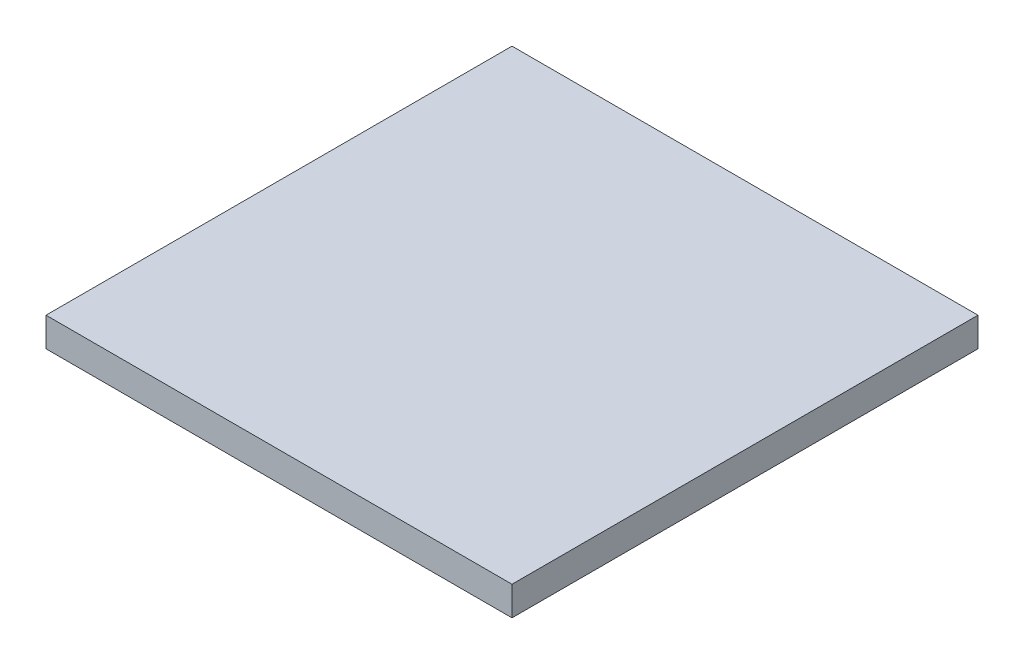
ISO-10303-21;
HEADER;
FILE_DESCRIPTION(('STEP AP214'),'2;1');
FILE_NAME('part.step','',(''),(''),'','','');
FILE_SCHEMA(('AUTOMOTIVE_DESIGN { 1 0 10303 214 1 1 1 1 }'));
ENDSEC;
DATA;
#1=APPLICATION_CONTEXT('core data for automotive mechanical design processes');
#2=APPLICATION_PROTOCOL_DEFINITION('international standard','automotive_design',2000,#1);
#3=PRODUCT_CONTEXT('',#1,'mechanical');
#4=PRODUCT('Part','Part','',(#3));
#5=PRODUCT_RELATED_PRODUCT_CATEGORY('part','',(#4));
#6=PRODUCT_DEFINITION_FORMATION('','',#4);
#7=PRODUCT_DEFINITION_CONTEXT('part definition',#1,'design');
#8=PRODUCT_DEFINITION('design','',#6,#7);
#9=PRODUCT_DEFINITION_SHAPE('','',#8);
#10=(LENGTH_UNIT() NAMED_UNIT(*) SI_UNIT(.MILLI.,.METRE.));
#11=(NAMED_UNIT(*) PLANE_ANGLE_UNIT() SI_UNIT($,.RADIAN.));
#12=(NAMED_UNIT(*) SI_UNIT($,.STERADIAN.) SOLID_ANGLE_UNIT());
#13=UNCERTAINTY_MEASURE_WITH_UNIT(LENGTH_MEASURE(1.E-05),#10,'distance_accuracy_value','');
#14=(GEOMETRIC_REPRESENTATION_CONTEXT(3) GLOBAL_UNCERTAINTY_ASSIGNED_CONTEXT((#13)) GLOBAL_UNIT_ASSIGNED_CONTEXT((#10,
#11,#12)) REPRESENTATION_CONTEXT('',''));
#15=CARTESIAN_POINT('',(0.,0.,0.));
#16=DIRECTION('',(0.,0.,1.));
#17=DIRECTION('',(1.,0.,0.));
#18=AXIS2_PLACEMENT_3D('',#15,#16,#17);
#19=CARTESIAN_POINT('',(304.8,38.1,-304.8));
#20=DIRECTION('',(-1.,0.,0.));
#21=DIRECTION('',(0.,0.,1.));
#22=AXIS2_PLACEMENT_3D('',#19,#20,#21);
#23=PLANE('',#22);
#24=DIRECTION('',(0.,0.,-1.));
#25=VECTOR('',#24,1.);
#26=CARTESIAN_POINT('',(304.8,0.,-304.8));
#27=LINE('',#26,#25);
#28=CARTESIAN_POINT('',(304.8,0.,304.8));
#29=VERTEX_POINT('',#28);
#30=CARTESIAN_POINT('',(304.8,0.,-304.8));
#31=VERTEX_POINT('',#30);
#32=EDGE_CURVE('E95',#29,#31,#27,.T.);
#33=ORIENTED_EDGE('',*,*,#32,.T.);
#34=DIRECTION('',(0.,-1.,0.));
#35=VECTOR('',#34,1.);
#36=CARTESIAN_POINT('',(304.8,38.1,-304.8));
#37=LINE('',#36,#35);
#38=CARTESIAN_POINT('',(304.8,38.1,-304.8));
#39=VERTEX_POINT('',#38);
#40=EDGE_CURVE('E11',#39,#31,#37,.T.);
#41=ORIENTED_EDGE('',*,*,#40,.F.);
#42=DIRECTION('',(0.,0.,-1.));
#43=VECTOR('',#42,1.);
#44=CARTESIAN_POINT('',(304.8,38.1,-304.8));
#45=LINE('',#44,#43);
#46=CARTESIAN_POINT('',(304.8,38.1,304.8));
#47=VERTEX_POINT('',#46);
#48=EDGE_CURVE('E83',#47,#39,#45,.T.);
#49=ORIENTED_EDGE('',*,*,#48,.F.);
#50=DIRECTION('',(0.,-1.,0.));
#51=VECTOR('',#50,1.);
#52=CARTESIAN_POINT('',(304.8,38.1,304.8));
#53=LINE('',#52,#51);
#54=EDGE_CURVE('E91',#47,#29,#53,.T.);
#55=ORIENTED_EDGE('',*,*,#54,.T.);
#56=EDGE_LOOP('',(#33,#41,#49,#55));
#57=FACE_BOUND('',#56,.T.);
#58=ADVANCED_FACE('F32',(#57),#23,.F.);
#59=CARTESIAN_POINT('',(-304.8,38.1,-304.8));
#60=DIRECTION('',(0.,0.,1.));
#61=DIRECTION('',(1.,0.,0.));
#62=AXIS2_PLACEMENT_3D('',#59,#60,#61);
#63=PLANE('',#62);
#64=DIRECTION('',(-1.,0.,0.));
#65=VECTOR('',#64,1.);
#66=CARTESIAN_POINT('',(-304.8,0.,-304.8));
#67=LINE('',#66,#65);
#68=CARTESIAN_POINT('',(-304.8,0.,-304.8));
#69=VERTEX_POINT('',#68);
#70=EDGE_CURVE('E87',#31,#69,#67,.T.);
#71=ORIENTED_EDGE('',*,*,#70,.T.);
#72=DIRECTION('',(0.,-1.,0.));
#73=VECTOR('',#72,1.);
#74=CARTESIAN_POINT('',(-304.8,38.1,-304.8));
#75=LINE('',#74,#73);
#76=CARTESIAN_POINT('',(-304.8,38.1,-304.8));
#77=VERTEX_POINT('',#76);
#78=EDGE_CURVE('E40',#77,#69,#75,.T.);
#79=ORIENTED_EDGE('',*,*,#78,.F.);
#80=DIRECTION('',(-1.,0.,0.));
#81=VECTOR('',#80,1.);
#82=CARTESIAN_POINT('',(-304.8,38.1,-304.8));
#83=LINE('',#82,#81);
#84=EDGE_CURVE('E78',#39,#77,#83,.T.);
#85=ORIENTED_EDGE('',*,*,#84,.F.);
#86=ORIENTED_EDGE('',*,*,#40,.T.);
#87=EDGE_LOOP('',(#71,#79,#85,#86));
#88=FACE_BOUND('',#87,.T.);
#89=ADVANCED_FACE('F86',(#88),#63,.F.);
#90=CARTESIAN_POINT('',(-304.8,38.1,-304.8));
#91=DIRECTION('',(1.,0.,0.));
#92=DIRECTION('',(0.,0.,-1.));
#93=AXIS2_PLACEMENT_3D('',#90,#91,#92);
#94=PLANE('',#93);
#95=DIRECTION('',(0.,0.,1.));
#96=VECTOR('',#95,1.);
#97=CARTESIAN_POINT('',(-304.8,0.,-304.8));
#98=LINE('',#97,#96);
#99=CARTESIAN_POINT('',(-304.8,0.,304.8));
#100=VERTEX_POINT('',#99);
#101=EDGE_CURVE('E65',#69,#100,#98,.T.);
#102=ORIENTED_EDGE('',*,*,#101,.T.);
#103=DIRECTION('',(0.,-1.,0.));
#104=VECTOR('',#103,1.);
#105=CARTESIAN_POINT('',(-304.8,38.1,304.8));
#106=LINE('',#105,#104);
#107=CARTESIAN_POINT('',(-304.8,38.1,304.8));
#108=VERTEX_POINT('',#107);
#109=EDGE_CURVE('E88',#108,#100,#106,.T.);
#110=ORIENTED_EDGE('',*,*,#109,.F.);
#111=DIRECTION('',(0.,0.,1.));
#112=VECTOR('',#111,1.);
#113=CARTESIAN_POINT('',(-304.8,38.1,-304.8));
#114=LINE('',#113,#112);
#115=EDGE_CURVE('E81',#77,#108,#114,.T.);
#116=ORIENTED_EDGE('',*,*,#115,.F.);
#117=ORIENTED_EDGE('',*,*,#78,.T.);
#118=EDGE_LOOP('',(#102,#110,#116,#117));
#119=FACE_BOUND('',#118,.T.);
#120=ADVANCED_FACE('F89',(#119),#94,.F.);
#121=CARTESIAN_POINT('',(-304.8,38.1,304.8));
#122=DIRECTION('',(0.,0.,-1.));
#123=DIRECTION('',(-1.,0.,0.));
#124=AXIS2_PLACEMENT_3D('',#121,#122,#123);
#125=PLANE('',#124);
#126=DIRECTION('',(1.,0.,0.));
#127=VECTOR('',#126,1.);
#128=CARTESIAN_POINT('',(-304.8,0.,304.8));
#129=LINE('',#128,#127);
#130=EDGE_CURVE('E71',#100,#29,#129,.T.);
#131=ORIENTED_EDGE('',*,*,#130,.T.);
#132=ORIENTED_EDGE('',*,*,#54,.F.);
#133=DIRECTION('',(1.,0.,0.));
#134=VECTOR('',#133,1.);
#135=CARTESIAN_POINT('',(-304.8,38.1,304.8));
#136=LINE('',#135,#134);
#137=EDGE_CURVE('E48',#108,#47,#136,.T.);
#138=ORIENTED_EDGE('',*,*,#137,.F.);
#139=ORIENTED_EDGE('',*,*,#109,.T.);
#140=EDGE_LOOP('',(#131,#132,#138,#139));
#141=FACE_BOUND('',#140,.T.);
#142=ADVANCED_FACE('F102',(#141),#125,.F.);
#143=CARTESIAN_POINT('',(0.,38.1,0.));
#144=DIRECTION('',(0.,1.,0.));
#145=DIRECTION('',(0.,0.,1.));
#146=AXIS2_PLACEMENT_3D('',#143,#144,#145);
#147=PLANE('',#146);
#148=ORIENTED_EDGE('',*,*,#48,.T.);
#149=ORIENTED_EDGE('',*,*,#84,.T.);
#150=ORIENTED_EDGE('',*,*,#115,.T.);
#151=ORIENTED_EDGE('',*,*,#137,.T.);
#152=EDGE_LOOP('',(#148,#149,#150,#151));
#153=FACE_BOUND('',#152,.T.);
#154=ADVANCED_FACE('F79',(#153),#147,.T.);
#155=CARTESIAN_POINT('',(0.,0.,0.));
#156=DIRECTION('',(0.,1.,0.));
#157=DIRECTION('',(0.,0.,1.));
#158=AXIS2_PLACEMENT_3D('',#155,#156,#157);
#159=PLANE('',#158);
#160=ORIENTED_EDGE('',*,*,#32,.F.);
#161=ORIENTED_EDGE('',*,*,#130,.F.);
#162=ORIENTED_EDGE('',*,*,#101,.F.);
#163=ORIENTED_EDGE('',*,*,#70,.F.);
#164=EDGE_LOOP('',(#160,#161,#162,#163));
#165=FACE_BOUND('',#164,.T.);
#166=ADVANCED_FACE('F105',(#165),#159,.F.);
#167=CLOSED_SHELL('',(#58,#89,#120,#142,#154,#166));
#168=MANIFOLD_SOLID_BREP('B2',#167);
#169=ADVANCED_BREP_SHAPE_REPRESENTATION('',(#18,#168),#14);
#170=SHAPE_DEFINITION_REPRESENTATION(#9,#169);
ENDSEC;
END-ISO-10303-21;
